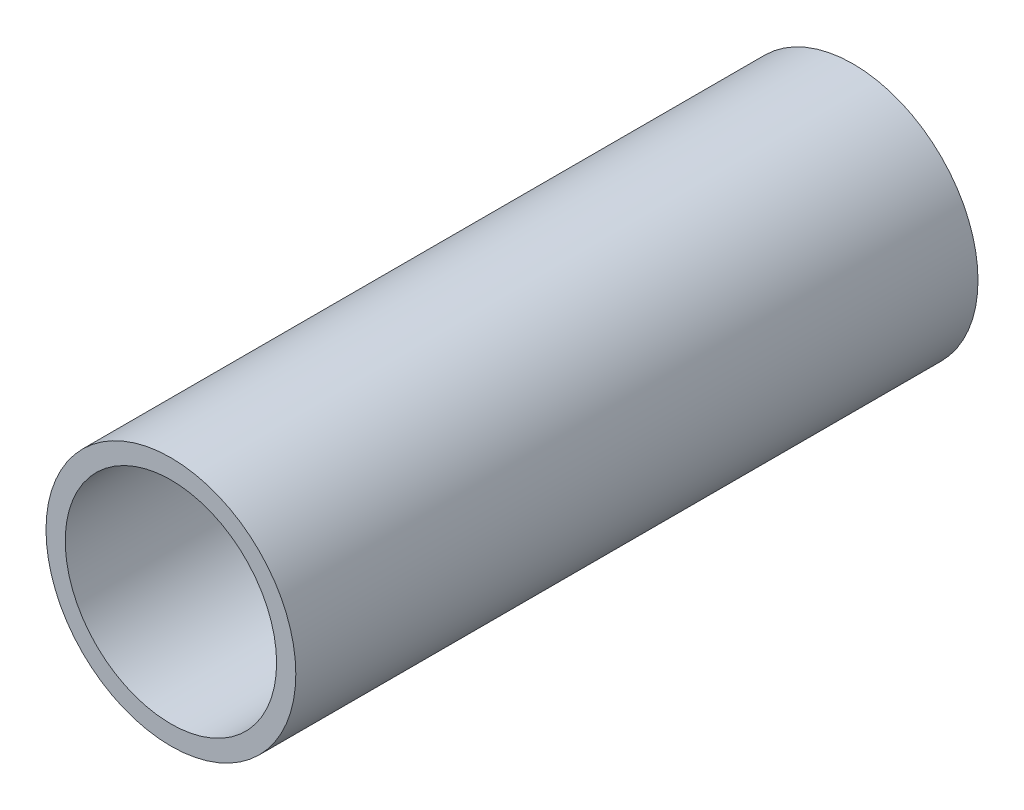
ISO-10303-21;
HEADER;
FILE_DESCRIPTION(('STEP AP214'),'2;1');
FILE_NAME('part.step','',(''),(''),'','','');
FILE_SCHEMA(('AUTOMOTIVE_DESIGN { 1 0 10303 214 1 1 1 1 }'));
ENDSEC;
DATA;
#1=APPLICATION_CONTEXT('core data for automotive mechanical design processes');
#2=APPLICATION_PROTOCOL_DEFINITION('international standard','automotive_design',2000,#1);
#3=PRODUCT_CONTEXT('',#1,'mechanical');
#4=PRODUCT('Part','Part','',(#3));
#5=PRODUCT_RELATED_PRODUCT_CATEGORY('part','',(#4));
#6=PRODUCT_DEFINITION_FORMATION('','',#4);
#7=PRODUCT_DEFINITION_CONTEXT('part definition',#1,'design');
#8=PRODUCT_DEFINITION('design','',#6,#7);
#9=PRODUCT_DEFINITION_SHAPE('','',#8);
#10=(LENGTH_UNIT() NAMED_UNIT(*) SI_UNIT(.MILLI.,.METRE.));
#11=(NAMED_UNIT(*) PLANE_ANGLE_UNIT() SI_UNIT($,.RADIAN.));
#12=(NAMED_UNIT(*) SI_UNIT($,.STERADIAN.) SOLID_ANGLE_UNIT());
#13=UNCERTAINTY_MEASURE_WITH_UNIT(LENGTH_MEASURE(1.E-05),#10,'distance_accuracy_value','');
#14=(GEOMETRIC_REPRESENTATION_CONTEXT(3) GLOBAL_UNCERTAINTY_ASSIGNED_CONTEXT((#13)) GLOBAL_UNIT_ASSIGNED_CONTEXT((#10,
#11,#12)) REPRESENTATION_CONTEXT('',''));
#15=CARTESIAN_POINT('',(0.,0.,0.));
#16=DIRECTION('',(0.,0.,1.));
#17=DIRECTION('',(1.,0.,0.));
#18=AXIS2_PLACEMENT_3D('',#15,#16,#17);
#19=CARTESIAN_POINT('',(0.,0.,71.));
#20=DIRECTION('',(0.,0.,1.));
#21=DIRECTION('',(1.,0.,0.));
#22=AXIS2_PLACEMENT_3D('',#19,#20,#21);
#23=PLANE('',#22);
#24=CARTESIAN_POINT('',(0.,0.,71.));
#25=DIRECTION('',(0.,0.,1.));
#26=DIRECTION('',(1.,0.,0.));
#27=AXIS2_PLACEMENT_3D('',#24,#25,#26);
#28=CIRCLE('',#27,13.);
#29=CARTESIAN_POINT('',(13.,0.,71.));
#30=VERTEX_POINT('',#29);
#31=EDGE_CURVE('E10',#30,#30,#28,.T.);
#32=ORIENTED_EDGE('',*,*,#31,.T.);
#33=EDGE_LOOP('',(#32));
#34=FACE_BOUND('',#33,.T.);
#35=CARTESIAN_POINT('',(0.,0.,71.));
#36=DIRECTION('',(0.,0.,1.));
#37=DIRECTION('',(1.,0.,0.));
#38=AXIS2_PLACEMENT_3D('',#35,#36,#37);
#39=CIRCLE('',#38,11.);
#40=CARTESIAN_POINT('',(11.,0.,71.));
#41=VERTEX_POINT('',#40);
#42=EDGE_CURVE('E56',#41,#41,#39,.T.);
#43=ORIENTED_EDGE('',*,*,#42,.F.);
#44=EDGE_LOOP('',(#43));
#45=FACE_BOUND('',#44,.T.);
#46=ADVANCED_FACE('F43',(#34,#45),#23,.T.);
#47=CARTESIAN_POINT('',(0.,0.,0.));
#48=DIRECTION('',(0.,0.,1.));
#49=DIRECTION('',(1.,0.,0.));
#50=AXIS2_PLACEMENT_3D('',#47,#48,#49);
#51=PLANE('',#50);
#52=CARTESIAN_POINT('',(0.,0.,0.));
#53=DIRECTION('',(0.,0.,1.));
#54=DIRECTION('',(1.,0.,0.));
#55=AXIS2_PLACEMENT_3D('',#52,#53,#54);
#56=CIRCLE('',#55,13.);
#57=CARTESIAN_POINT('',(13.,0.,0.));
#58=VERTEX_POINT('',#57);
#59=EDGE_CURVE('E47',#58,#58,#56,.T.);
#60=ORIENTED_EDGE('',*,*,#59,.F.);
#61=EDGE_LOOP('',(#60));
#62=FACE_BOUND('',#61,.T.);
#63=CARTESIAN_POINT('',(0.,0.,0.));
#64=DIRECTION('',(0.,0.,1.));
#65=DIRECTION('',(1.,0.,0.));
#66=AXIS2_PLACEMENT_3D('',#63,#64,#65);
#67=CIRCLE('',#66,11.);
#68=CARTESIAN_POINT('',(11.,0.,0.));
#69=VERTEX_POINT('',#68);
#70=EDGE_CURVE('E58',#69,#69,#67,.T.);
#71=ORIENTED_EDGE('',*,*,#70,.T.);
#72=EDGE_LOOP('',(#71));
#73=FACE_BOUND('',#72,.T.);
#74=ADVANCED_FACE('F70',(#62,#73),#51,.F.);
#75=CARTESIAN_POINT('',(0.,0.,71.));
#76=DIRECTION('',(0.,0.,-1.));
#77=DIRECTION('',(-1.,0.,0.));
#78=AXIS2_PLACEMENT_3D('',#75,#76,#77);
#79=CYLINDRICAL_SURFACE('',#78,13.);
#80=ORIENTED_EDGE('',*,*,#31,.F.);
#81=EDGE_LOOP('',(#80));
#82=FACE_BOUND('',#81,.T.);
#83=ORIENTED_EDGE('',*,*,#59,.T.);
#84=EDGE_LOOP('',(#83));
#85=FACE_BOUND('',#84,.T.);
#86=ADVANCED_FACE('F45',(#82,#85),#79,.T.);
#87=CARTESIAN_POINT('',(0.,0.,71.));
#88=DIRECTION('',(0.,0.,-1.));
#89=DIRECTION('',(-1.,0.,0.));
#90=AXIS2_PLACEMENT_3D('',#87,#88,#89);
#91=CYLINDRICAL_SURFACE('',#90,11.);
#92=ORIENTED_EDGE('',*,*,#42,.T.);
#93=EDGE_LOOP('',(#92));
#94=FACE_BOUND('',#93,.T.);
#95=ORIENTED_EDGE('',*,*,#70,.F.);
#96=EDGE_LOOP('',(#95));
#97=FACE_BOUND('',#96,.T.);
#98=ADVANCED_FACE('F66',(#94,#97),#91,.F.);
#99=CLOSED_SHELL('',(#46,#74,#86,#98));
#100=MANIFOLD_SOLID_BREP('B2',#99);
#101=ADVANCED_BREP_SHAPE_REPRESENTATION('',(#18,#100),#14);
#102=SHAPE_DEFINITION_REPRESENTATION(#9,#101);
ENDSEC;
END-ISO-10303-21;
